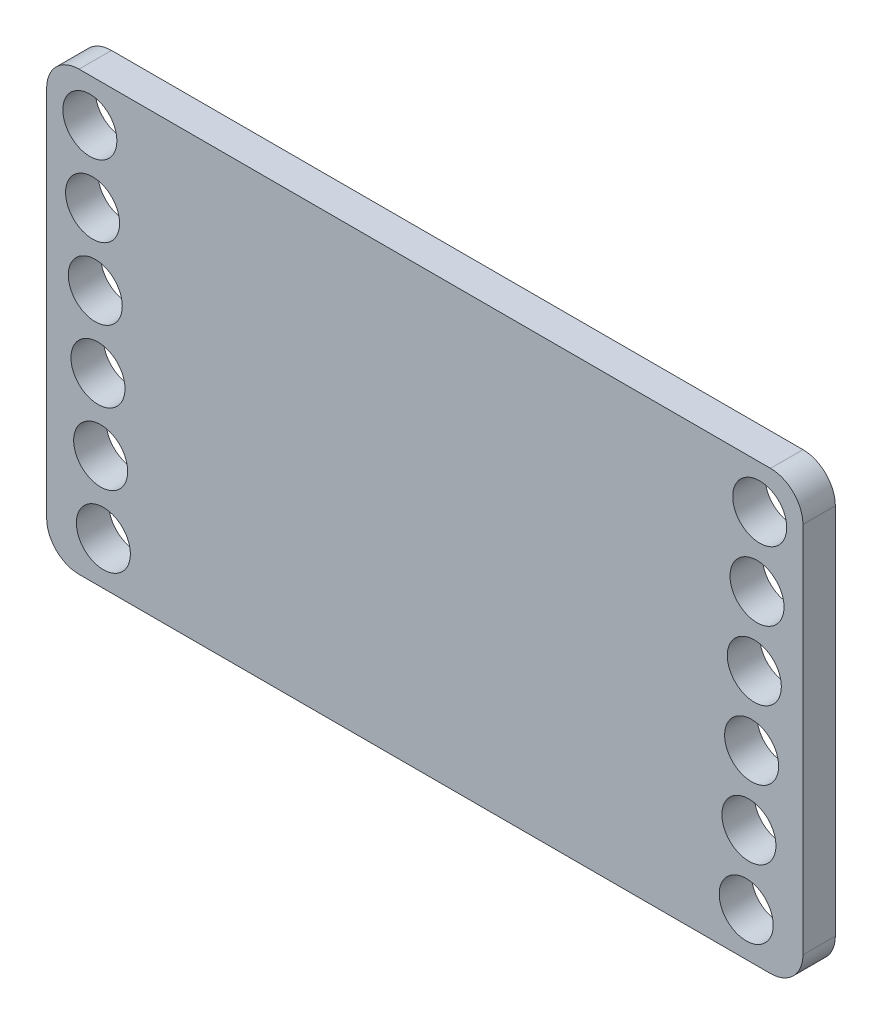
ISO-10303-21;
HEADER;
FILE_DESCRIPTION(('STEP AP214'),'2;1');
FILE_NAME('part.step','',(''),(''),'','','');
FILE_SCHEMA(('AUTOMOTIVE_DESIGN { 1 0 10303 214 1 1 1 1 }'));
ENDSEC;
DATA;
#1=APPLICATION_CONTEXT('core data for automotive mechanical design processes');
#2=APPLICATION_PROTOCOL_DEFINITION('international standard','automotive_design',2000,#1);
#3=PRODUCT_CONTEXT('',#1,'mechanical');
#4=PRODUCT('Part','Part','',(#3));
#5=PRODUCT_RELATED_PRODUCT_CATEGORY('part','',(#4));
#6=PRODUCT_DEFINITION_FORMATION('','',#4);
#7=PRODUCT_DEFINITION_CONTEXT('part definition',#1,'design');
#8=PRODUCT_DEFINITION('design','',#6,#7);
#9=PRODUCT_DEFINITION_SHAPE('','',#8);
#10=(LENGTH_UNIT() NAMED_UNIT(*) SI_UNIT(.MILLI.,.METRE.));
#11=(NAMED_UNIT(*) PLANE_ANGLE_UNIT() SI_UNIT($,.RADIAN.));
#12=(NAMED_UNIT(*) SI_UNIT($,.STERADIAN.) SOLID_ANGLE_UNIT());
#13=UNCERTAINTY_MEASURE_WITH_UNIT(LENGTH_MEASURE(1.E-05),#10,'distance_accuracy_value','');
#14=(GEOMETRIC_REPRESENTATION_CONTEXT(3) GLOBAL_UNCERTAINTY_ASSIGNED_CONTEXT((#13)) GLOBAL_UNIT_ASSIGNED_CONTEXT((#10,
#11,#12)) REPRESENTATION_CONTEXT('',''));
#15=CARTESIAN_POINT('',(0.,0.,0.));
#16=DIRECTION('',(0.,0.,1.));
#17=DIRECTION('',(1.,0.,0.));
#18=AXIS2_PLACEMENT_3D('',#15,#16,#17);
#19=CARTESIAN_POINT('',(-35.,0.,3.));
#20=DIRECTION('',(-1.,0.,0.));
#21=DIRECTION('',(0.,-1.,0.));
#22=AXIS2_PLACEMENT_3D('',#19,#20,#21);
#23=PLANE('',#22);
#24=DIRECTION('',(0.,1.,0.));
#25=VECTOR('',#24,1.);
#26=CARTESIAN_POINT('',(-35.,0.,3.));
#27=LINE('',#26,#25);
#28=CARTESIAN_POINT('',(-35.,2.50000000000001,3.));
#29=VERTEX_POINT('',#28);
#30=CARTESIAN_POINT('',(-35.,37.,3.));
#31=VERTEX_POINT('',#30);
#32=EDGE_CURVE('E203',#29,#31,#27,.T.);
#33=ORIENTED_EDGE('',*,*,#32,.T.);
#34=DIRECTION('',(0.,0.,-1.));
#35=VECTOR('',#34,1.);
#36=CARTESIAN_POINT('',(-35.,37.,3.));
#37=LINE('',#36,#35);
#38=CARTESIAN_POINT('',(-35.,37.,0.));
#39=VERTEX_POINT('',#38);
#40=EDGE_CURVE('E151',#31,#39,#37,.T.);
#41=ORIENTED_EDGE('',*,*,#40,.T.);
#42=DIRECTION('',(0.,1.,0.));
#43=VECTOR('',#42,1.);
#44=CARTESIAN_POINT('',(-35.,0.,0.));
#45=LINE('',#44,#43);
#46=CARTESIAN_POINT('',(-35.,2.50000000000001,0.));
#47=VERTEX_POINT('',#46);
#48=EDGE_CURVE('E105',#47,#39,#45,.T.);
#49=ORIENTED_EDGE('',*,*,#48,.F.);
#50=DIRECTION('',(0.,0.,-1.));
#51=VECTOR('',#50,1.);
#52=CARTESIAN_POINT('',(-35.,2.50000000000001,3.));
#53=LINE('',#52,#51);
#54=EDGE_CURVE('E149',#47,#29,#53,.F.);
#55=ORIENTED_EDGE('',*,*,#54,.T.);
#56=EDGE_LOOP('',(#33,#41,#49,#55));
#57=FACE_BOUND('',#56,.T.);
#58=ADVANCED_FACE('F35',(#57),#23,.T.);
#59=CARTESIAN_POINT('',(0.,-0.499999999999993,3.));
#60=DIRECTION('',(0.,1.,0.));
#61=DIRECTION('',(0.,0.,1.));
#62=AXIS2_PLACEMENT_3D('',#59,#60,#61);
#63=PLANE('',#62);
#64=DIRECTION('',(1.,0.,0.));
#65=VECTOR('',#64,1.);
#66=CARTESIAN_POINT('',(0.,-0.499999999999993,0.));
#67=LINE('',#66,#65);
#68=CARTESIAN_POINT('',(-32.,-0.499999999999993,0.));
#69=VERTEX_POINT('',#68);
#70=CARTESIAN_POINT('',(32.,-0.499999999999993,0.));
#71=VERTEX_POINT('',#70);
#72=EDGE_CURVE('E156',#69,#71,#67,.T.);
#73=ORIENTED_EDGE('',*,*,#72,.T.);
#74=DIRECTION('',(0.,0.,-1.));
#75=VECTOR('',#74,1.);
#76=CARTESIAN_POINT('',(32.,-0.499999999999993,3.));
#77=LINE('',#76,#75);
#78=CARTESIAN_POINT('',(32.,-0.499999999999993,3.));
#79=VERTEX_POINT('',#78);
#80=EDGE_CURVE('E11',#71,#79,#77,.F.);
#81=ORIENTED_EDGE('',*,*,#80,.T.);
#82=DIRECTION('',(1.,0.,0.));
#83=VECTOR('',#82,1.);
#84=CARTESIAN_POINT('',(0.,-0.499999999999993,3.));
#85=LINE('',#84,#83);
#86=CARTESIAN_POINT('',(-32.,-0.499999999999993,3.));
#87=VERTEX_POINT('',#86);
#88=EDGE_CURVE('E157',#87,#79,#85,.T.);
#89=ORIENTED_EDGE('',*,*,#88,.F.);
#90=DIRECTION('',(0.,0.,-1.));
#91=VECTOR('',#90,1.);
#92=CARTESIAN_POINT('',(-32.,-0.499999999999993,0.));
#93=LINE('',#92,#91);
#94=EDGE_CURVE('E43',#87,#69,#93,.T.);
#95=ORIENTED_EDGE('',*,*,#94,.T.);
#96=EDGE_LOOP('',(#73,#81,#89,#95));
#97=FACE_BOUND('',#96,.T.);
#98=ADVANCED_FACE('F155',(#97),#63,.F.);
#99=CARTESIAN_POINT('',(35.,0.,3.));
#100=DIRECTION('',(-1.,0.,0.));
#101=DIRECTION('',(0.,-1.,0.));
#102=AXIS2_PLACEMENT_3D('',#99,#100,#101);
#103=PLANE('',#102);
#104=DIRECTION('',(0.,1.,0.));
#105=VECTOR('',#104,1.);
#106=CARTESIAN_POINT('',(35.,0.,0.));
#107=LINE('',#106,#105);
#108=CARTESIAN_POINT('',(35.,2.50000000000001,0.));
#109=VERTEX_POINT('',#108);
#110=CARTESIAN_POINT('',(35.,37.,0.));
#111=VERTEX_POINT('',#110);
#112=EDGE_CURVE('E122',#109,#111,#107,.T.);
#113=ORIENTED_EDGE('',*,*,#112,.T.);
#114=DIRECTION('',(0.,0.,-1.));
#115=VECTOR('',#114,1.);
#116=CARTESIAN_POINT('',(35.,37.,3.));
#117=LINE('',#116,#115);
#118=CARTESIAN_POINT('',(35.,37.,3.));
#119=VERTEX_POINT('',#118);
#120=EDGE_CURVE('E141',#111,#119,#117,.F.);
#121=ORIENTED_EDGE('',*,*,#120,.T.);
#122=DIRECTION('',(0.,1.,0.));
#123=VECTOR('',#122,1.);
#124=CARTESIAN_POINT('',(35.,0.,3.));
#125=LINE('',#124,#123);
#126=CARTESIAN_POINT('',(35.,2.50000000000001,3.));
#127=VERTEX_POINT('',#126);
#128=EDGE_CURVE('E131',#127,#119,#125,.T.);
#129=ORIENTED_EDGE('',*,*,#128,.F.);
#130=DIRECTION('',(0.,0.,-1.));
#131=VECTOR('',#130,1.);
#132=CARTESIAN_POINT('',(35.,2.50000000000001,3.));
#133=LINE('',#132,#131);
#134=EDGE_CURVE('E138',#127,#109,#133,.T.);
#135=ORIENTED_EDGE('',*,*,#134,.T.);
#136=EDGE_LOOP('',(#113,#121,#129,#135));
#137=FACE_BOUND('',#136,.T.);
#138=ADVANCED_FACE('F278',(#137),#103,.F.);
#139=CARTESIAN_POINT('',(30.5,23.,3.));
#140=DIRECTION('',(0.,0.,-1.));
#141=DIRECTION('',(-1.,0.,0.));
#142=AXIS2_PLACEMENT_3D('',#139,#140,#141);
#143=CYLINDRICAL_SURFACE('',#142,2.5);
#144=CARTESIAN_POINT('',(30.5,23.,3.));
#145=DIRECTION('',(0.,0.,1.));
#146=DIRECTION('',(1.,0.,0.));
#147=AXIS2_PLACEMENT_3D('',#144,#145,#146);
#148=CIRCLE('',#147,2.5);
#149=CARTESIAN_POINT('',(33.,23.,3.));
#150=VERTEX_POINT('',#149);
#151=EDGE_CURVE('E206',#150,#150,#148,.T.);
#152=ORIENTED_EDGE('',*,*,#151,.T.);
#153=EDGE_LOOP('',(#152));
#154=FACE_BOUND('',#153,.T.);
#155=CARTESIAN_POINT('',(30.5,23.,0.));
#156=DIRECTION('',(0.,0.,1.));
#157=DIRECTION('',(1.,0.,0.));
#158=AXIS2_PLACEMENT_3D('',#155,#156,#157);
#159=CIRCLE('',#158,2.5);
#160=CARTESIAN_POINT('',(33.,23.,0.));
#161=VERTEX_POINT('',#160);
#162=EDGE_CURVE('E162',#161,#161,#159,.T.);
#163=ORIENTED_EDGE('',*,*,#162,.F.);
#164=EDGE_LOOP('',(#163));
#165=FACE_BOUND('',#164,.T.);
#166=ADVANCED_FACE('F296',(#154,#165),#143,.F.);
#167=CARTESIAN_POINT('',(-30.5,23.,3.));
#168=DIRECTION('',(0.,0.,-1.));
#169=DIRECTION('',(-1.,0.,0.));
#170=AXIS2_PLACEMENT_3D('',#167,#168,#169);
#171=CYLINDRICAL_SURFACE('',#170,2.5);
#172=CARTESIAN_POINT('',(-30.5,23.,3.));
#173=DIRECTION('',(0.,0.,1.));
#174=DIRECTION('',(1.,0.,0.));
#175=AXIS2_PLACEMENT_3D('',#172,#173,#174);
#176=CIRCLE('',#175,2.5);
#177=CARTESIAN_POINT('',(-28.,23.,3.));
#178=VERTEX_POINT('',#177);
#179=EDGE_CURVE('E209',#178,#178,#176,.T.);
#180=ORIENTED_EDGE('',*,*,#179,.T.);
#181=EDGE_LOOP('',(#180));
#182=FACE_BOUND('',#181,.T.);
#183=CARTESIAN_POINT('',(-30.5,23.,0.));
#184=DIRECTION('',(0.,0.,1.));
#185=DIRECTION('',(1.,0.,0.));
#186=AXIS2_PLACEMENT_3D('',#183,#184,#185);
#187=CIRCLE('',#186,2.5);
#188=CARTESIAN_POINT('',(-28.,23.,0.));
#189=VERTEX_POINT('',#188);
#190=EDGE_CURVE('E167',#189,#189,#187,.T.);
#191=ORIENTED_EDGE('',*,*,#190,.F.);
#192=EDGE_LOOP('',(#191));
#193=FACE_BOUND('',#192,.T.);
#194=ADVANCED_FACE('F299',(#182,#193),#171,.F.);
#195=CARTESIAN_POINT('',(-30.25,16.5,3.));
#196=DIRECTION('',(0.,0.,-1.));
#197=DIRECTION('',(-1.,0.,0.));
#198=AXIS2_PLACEMENT_3D('',#195,#196,#197);
#199=CYLINDRICAL_SURFACE('',#198,2.5);
#200=CARTESIAN_POINT('',(-30.25,16.5,3.));
#201=DIRECTION('',(0.,0.,1.));
#202=DIRECTION('',(1.,0.,0.));
#203=AXIS2_PLACEMENT_3D('',#200,#201,#202);
#204=CIRCLE('',#203,2.5);
#205=CARTESIAN_POINT('',(-27.75,16.5,3.));
#206=VERTEX_POINT('',#205);
#207=EDGE_CURVE('E212',#206,#206,#204,.T.);
#208=ORIENTED_EDGE('',*,*,#207,.T.);
#209=EDGE_LOOP('',(#208));
#210=FACE_BOUND('',#209,.T.);
#211=CARTESIAN_POINT('',(-30.25,16.5,0.));
#212=DIRECTION('',(0.,0.,1.));
#213=DIRECTION('',(1.,0.,0.));
#214=AXIS2_PLACEMENT_3D('',#211,#212,#213);
#215=CIRCLE('',#214,2.5);
#216=CARTESIAN_POINT('',(-27.75,16.5,0.));
#217=VERTEX_POINT('',#216);
#218=EDGE_CURVE('E170',#217,#217,#215,.T.);
#219=ORIENTED_EDGE('',*,*,#218,.F.);
#220=EDGE_LOOP('',(#219));
#221=FACE_BOUND('',#220,.T.);
#222=ADVANCED_FACE('F303',(#210,#221),#199,.F.);
#223=CARTESIAN_POINT('',(30.25,16.5,3.));
#224=DIRECTION('',(0.,0.,-1.));
#225=DIRECTION('',(-1.,0.,0.));
#226=AXIS2_PLACEMENT_3D('',#223,#224,#225);
#227=CYLINDRICAL_SURFACE('',#226,2.5);
#228=CARTESIAN_POINT('',(30.25,16.5,3.));
#229=DIRECTION('',(0.,0.,1.));
#230=DIRECTION('',(1.,0.,0.));
#231=AXIS2_PLACEMENT_3D('',#228,#229,#230);
#232=CIRCLE('',#231,2.5);
#233=CARTESIAN_POINT('',(32.75,16.5,3.));
#234=VERTEX_POINT('',#233);
#235=EDGE_CURVE('E215',#234,#234,#232,.T.);
#236=ORIENTED_EDGE('',*,*,#235,.T.);
#237=EDGE_LOOP('',(#236));
#238=FACE_BOUND('',#237,.T.);
#239=CARTESIAN_POINT('',(30.25,16.5,0.));
#240=DIRECTION('',(0.,0.,1.));
#241=DIRECTION('',(1.,0.,0.));
#242=AXIS2_PLACEMENT_3D('',#239,#240,#241);
#243=CIRCLE('',#242,2.5);
#244=CARTESIAN_POINT('',(32.75,16.5,0.));
#245=VERTEX_POINT('',#244);
#246=EDGE_CURVE('E173',#245,#245,#243,.T.);
#247=ORIENTED_EDGE('',*,*,#246,.F.);
#248=EDGE_LOOP('',(#247));
#249=FACE_BOUND('',#248,.T.);
#250=ADVANCED_FACE('F307',(#238,#249),#227,.F.);
#251=CARTESIAN_POINT('',(30.,10.,3.));
#252=DIRECTION('',(0.,0.,-1.));
#253=DIRECTION('',(-1.,0.,0.));
#254=AXIS2_PLACEMENT_3D('',#251,#252,#253);
#255=CYLINDRICAL_SURFACE('',#254,2.5);
#256=CARTESIAN_POINT('',(30.,10.,3.));
#257=DIRECTION('',(0.,0.,1.));
#258=DIRECTION('',(1.,0.,0.));
#259=AXIS2_PLACEMENT_3D('',#256,#257,#258);
#260=CIRCLE('',#259,2.5);
#261=CARTESIAN_POINT('',(32.5,10.,3.));
#262=VERTEX_POINT('',#261);
#263=EDGE_CURVE('E218',#262,#262,#260,.T.);
#264=ORIENTED_EDGE('',*,*,#263,.T.);
#265=EDGE_LOOP('',(#264));
#266=FACE_BOUND('',#265,.T.);
#267=CARTESIAN_POINT('',(30.,10.,0.));
#268=DIRECTION('',(0.,0.,1.));
#269=DIRECTION('',(1.,0.,0.));
#270=AXIS2_PLACEMENT_3D('',#267,#268,#269);
#271=CIRCLE('',#270,2.5);
#272=CARTESIAN_POINT('',(32.5,10.,0.));
#273=VERTEX_POINT('',#272);
#274=EDGE_CURVE('E176',#273,#273,#271,.T.);
#275=ORIENTED_EDGE('',*,*,#274,.F.);
#276=EDGE_LOOP('',(#275));
#277=FACE_BOUND('',#276,.T.);
#278=ADVANCED_FACE('F311',(#266,#277),#255,.F.);
#279=CARTESIAN_POINT('',(-30.,10.,3.));
#280=DIRECTION('',(0.,0.,-1.));
#281=DIRECTION('',(-1.,0.,0.));
#282=AXIS2_PLACEMENT_3D('',#279,#280,#281);
#283=CYLINDRICAL_SURFACE('',#282,2.5);
#284=CARTESIAN_POINT('',(-30.,10.,3.));
#285=DIRECTION('',(0.,0.,1.));
#286=DIRECTION('',(1.,0.,0.));
#287=AXIS2_PLACEMENT_3D('',#284,#285,#286);
#288=CIRCLE('',#287,2.5);
#289=CARTESIAN_POINT('',(-27.5,10.,3.));
#290=VERTEX_POINT('',#289);
#291=EDGE_CURVE('E221',#290,#290,#288,.T.);
#292=ORIENTED_EDGE('',*,*,#291,.T.);
#293=EDGE_LOOP('',(#292));
#294=FACE_BOUND('',#293,.T.);
#295=CARTESIAN_POINT('',(-30.,10.,0.));
#296=DIRECTION('',(0.,0.,1.));
#297=DIRECTION('',(1.,0.,0.));
#298=AXIS2_PLACEMENT_3D('',#295,#296,#297);
#299=CIRCLE('',#298,2.5);
#300=CARTESIAN_POINT('',(-27.5,10.,0.));
#301=VERTEX_POINT('',#300);
#302=EDGE_CURVE('E179',#301,#301,#299,.T.);
#303=ORIENTED_EDGE('',*,*,#302,.F.);
#304=EDGE_LOOP('',(#303));
#305=FACE_BOUND('',#304,.T.);
#306=ADVANCED_FACE('F315',(#294,#305),#283,.F.);
#307=CARTESIAN_POINT('',(-31.,36.,3.));
#308=DIRECTION('',(0.,0.,-1.));
#309=DIRECTION('',(-1.,0.,0.));
#310=AXIS2_PLACEMENT_3D('',#307,#308,#309);
#311=CYLINDRICAL_SURFACE('',#310,2.5);
#312=CARTESIAN_POINT('',(-31.,36.,3.));
#313=DIRECTION('',(0.,0.,1.));
#314=DIRECTION('',(1.,0.,0.));
#315=AXIS2_PLACEMENT_3D('',#312,#313,#314);
#316=CIRCLE('',#315,2.5);
#317=CARTESIAN_POINT('',(-28.5,36.,3.));
#318=VERTEX_POINT('',#317);
#319=EDGE_CURVE('E224',#318,#318,#316,.T.);
#320=ORIENTED_EDGE('',*,*,#319,.T.);
#321=EDGE_LOOP('',(#320));
#322=FACE_BOUND('',#321,.T.);
#323=CARTESIAN_POINT('',(-31.,36.,0.));
#324=DIRECTION('',(0.,0.,1.));
#325=DIRECTION('',(1.,0.,0.));
#326=AXIS2_PLACEMENT_3D('',#323,#324,#325);
#327=CIRCLE('',#326,2.5);
#328=CARTESIAN_POINT('',(-28.5,36.,0.));
#329=VERTEX_POINT('',#328);
#330=EDGE_CURVE('E182',#329,#329,#327,.T.);
#331=ORIENTED_EDGE('',*,*,#330,.F.);
#332=EDGE_LOOP('',(#331));
#333=FACE_BOUND('',#332,.T.);
#334=ADVANCED_FACE('F319',(#322,#333),#311,.F.);
#335=CARTESIAN_POINT('',(-30.75,29.5,3.));
#336=DIRECTION('',(0.,0.,-1.));
#337=DIRECTION('',(-1.,0.,0.));
#338=AXIS2_PLACEMENT_3D('',#335,#336,#337);
#339=CYLINDRICAL_SURFACE('',#338,2.5);
#340=CARTESIAN_POINT('',(-30.75,29.5,3.));
#341=DIRECTION('',(0.,0.,1.));
#342=DIRECTION('',(1.,0.,0.));
#343=AXIS2_PLACEMENT_3D('',#340,#341,#342);
#344=CIRCLE('',#343,2.5);
#345=CARTESIAN_POINT('',(-28.25,29.5,3.));
#346=VERTEX_POINT('',#345);
#347=EDGE_CURVE('E227',#346,#346,#344,.T.);
#348=ORIENTED_EDGE('',*,*,#347,.T.);
#349=EDGE_LOOP('',(#348));
#350=FACE_BOUND('',#349,.T.);
#351=CARTESIAN_POINT('',(-30.75,29.5,0.));
#352=DIRECTION('',(0.,0.,1.));
#353=DIRECTION('',(1.,0.,0.));
#354=AXIS2_PLACEMENT_3D('',#351,#352,#353);
#355=CIRCLE('',#354,2.5);
#356=CARTESIAN_POINT('',(-28.25,29.5,0.));
#357=VERTEX_POINT('',#356);
#358=EDGE_CURVE('E185',#357,#357,#355,.T.);
#359=ORIENTED_EDGE('',*,*,#358,.F.);
#360=EDGE_LOOP('',(#359));
#361=FACE_BOUND('',#360,.T.);
#362=ADVANCED_FACE('F323',(#350,#361),#339,.F.);
#363=CARTESIAN_POINT('',(30.75,29.5,3.));
#364=DIRECTION('',(0.,0.,-1.));
#365=DIRECTION('',(-1.,0.,0.));
#366=AXIS2_PLACEMENT_3D('',#363,#364,#365);
#367=CYLINDRICAL_SURFACE('',#366,2.5);
#368=CARTESIAN_POINT('',(30.75,29.5,3.));
#369=DIRECTION('',(0.,0.,1.));
#370=DIRECTION('',(1.,0.,0.));
#371=AXIS2_PLACEMENT_3D('',#368,#369,#370);
#372=CIRCLE('',#371,2.5);
#373=CARTESIAN_POINT('',(33.25,29.5,3.));
#374=VERTEX_POINT('',#373);
#375=EDGE_CURVE('E230',#374,#374,#372,.T.);
#376=ORIENTED_EDGE('',*,*,#375,.T.);
#377=EDGE_LOOP('',(#376));
#378=FACE_BOUND('',#377,.T.);
#379=CARTESIAN_POINT('',(30.75,29.5,0.));
#380=DIRECTION('',(0.,0.,1.));
#381=DIRECTION('',(1.,0.,0.));
#382=AXIS2_PLACEMENT_3D('',#379,#380,#381);
#383=CIRCLE('',#382,2.5);
#384=CARTESIAN_POINT('',(33.25,29.5,0.));
#385=VERTEX_POINT('',#384);
#386=EDGE_CURVE('E188',#385,#385,#383,.T.);
#387=ORIENTED_EDGE('',*,*,#386,.F.);
#388=EDGE_LOOP('',(#387));
#389=FACE_BOUND('',#388,.T.);
#390=ADVANCED_FACE('F327',(#378,#389),#367,.F.);
#391=CARTESIAN_POINT('',(31.,36.,3.));
#392=DIRECTION('',(0.,0.,-1.));
#393=DIRECTION('',(-1.,0.,0.));
#394=AXIS2_PLACEMENT_3D('',#391,#392,#393);
#395=CYLINDRICAL_SURFACE('',#394,2.5);
#396=CARTESIAN_POINT('',(31.,36.,3.));
#397=DIRECTION('',(0.,0.,1.));
#398=DIRECTION('',(1.,0.,0.));
#399=AXIS2_PLACEMENT_3D('',#396,#397,#398);
#400=CIRCLE('',#399,2.5);
#401=CARTESIAN_POINT('',(33.5,36.,3.));
#402=VERTEX_POINT('',#401);
#403=EDGE_CURVE('E233',#402,#402,#400,.T.);
#404=ORIENTED_EDGE('',*,*,#403,.T.);
#405=EDGE_LOOP('',(#404));
#406=FACE_BOUND('',#405,.T.);
#407=CARTESIAN_POINT('',(31.,36.,0.));
#408=DIRECTION('',(0.,0.,1.));
#409=DIRECTION('',(1.,0.,0.));
#410=AXIS2_PLACEMENT_3D('',#407,#408,#409);
#411=CIRCLE('',#410,2.5);
#412=CARTESIAN_POINT('',(33.5,36.,0.));
#413=VERTEX_POINT('',#412);
#414=EDGE_CURVE('E191',#413,#413,#411,.T.);
#415=ORIENTED_EDGE('',*,*,#414,.F.);
#416=EDGE_LOOP('',(#415));
#417=FACE_BOUND('',#416,.T.);
#418=ADVANCED_FACE('F331',(#406,#417),#395,.F.);
#419=CARTESIAN_POINT('',(-29.75,3.5,3.));
#420=DIRECTION('',(0.,0.,-1.));
#421=DIRECTION('',(-1.,0.,0.));
#422=AXIS2_PLACEMENT_3D('',#419,#420,#421);
#423=CYLINDRICAL_SURFACE('',#422,2.5);
#424=CARTESIAN_POINT('',(-29.75,3.5,3.));
#425=DIRECTION('',(0.,0.,1.));
#426=DIRECTION('',(1.,0.,0.));
#427=AXIS2_PLACEMENT_3D('',#424,#425,#426);
#428=CIRCLE('',#427,2.5);
#429=CARTESIAN_POINT('',(-27.25,3.5,3.));
#430=VERTEX_POINT('',#429);
#431=EDGE_CURVE('E236',#430,#430,#428,.T.);
#432=ORIENTED_EDGE('',*,*,#431,.T.);
#433=EDGE_LOOP('',(#432));
#434=FACE_BOUND('',#433,.T.);
#435=CARTESIAN_POINT('',(-29.75,3.5,0.));
#436=DIRECTION('',(0.,0.,1.));
#437=DIRECTION('',(1.,0.,0.));
#438=AXIS2_PLACEMENT_3D('',#435,#436,#437);
#439=CIRCLE('',#438,2.5);
#440=CARTESIAN_POINT('',(-27.25,3.5,0.));
#441=VERTEX_POINT('',#440);
#442=EDGE_CURVE('E194',#441,#441,#439,.T.);
#443=ORIENTED_EDGE('',*,*,#442,.F.);
#444=EDGE_LOOP('',(#443));
#445=FACE_BOUND('',#444,.T.);
#446=ADVANCED_FACE('F335',(#434,#445),#423,.F.);
#447=CARTESIAN_POINT('',(29.75,3.5,3.));
#448=DIRECTION('',(0.,0.,-1.));
#449=DIRECTION('',(-1.,0.,0.));
#450=AXIS2_PLACEMENT_3D('',#447,#448,#449);
#451=CYLINDRICAL_SURFACE('',#450,2.5);
#452=CARTESIAN_POINT('',(29.75,3.5,3.));
#453=DIRECTION('',(0.,0.,1.));
#454=DIRECTION('',(1.,0.,0.));
#455=AXIS2_PLACEMENT_3D('',#452,#453,#454);
#456=CIRCLE('',#455,2.5);
#457=CARTESIAN_POINT('',(32.25,3.5,3.));
#458=VERTEX_POINT('',#457);
#459=EDGE_CURVE('E121',#458,#458,#456,.T.);
#460=ORIENTED_EDGE('',*,*,#459,.T.);
#461=EDGE_LOOP('',(#460));
#462=FACE_BOUND('',#461,.T.);
#463=CARTESIAN_POINT('',(29.75,3.5,0.));
#464=DIRECTION('',(0.,0.,1.));
#465=DIRECTION('',(1.,0.,0.));
#466=AXIS2_PLACEMENT_3D('',#463,#464,#465);
#467=CIRCLE('',#466,2.5);
#468=CARTESIAN_POINT('',(32.25,3.5,0.));
#469=VERTEX_POINT('',#468);
#470=EDGE_CURVE('E197',#469,#469,#467,.T.);
#471=ORIENTED_EDGE('',*,*,#470,.F.);
#472=EDGE_LOOP('',(#471));
#473=FACE_BOUND('',#472,.T.);
#474=ADVANCED_FACE('F242',(#462,#473),#451,.F.);
#475=CARTESIAN_POINT('',(0.,40.,3.));
#476=DIRECTION('',(0.,1.,0.));
#477=DIRECTION('',(-1.,0.,0.));
#478=AXIS2_PLACEMENT_3D('',#475,#476,#477);
#479=PLANE('',#478);
#480=DIRECTION('',(1.,0.,0.));
#481=VECTOR('',#480,1.);
#482=CARTESIAN_POINT('',(0.,40.,3.));
#483=LINE('',#482,#481);
#484=CARTESIAN_POINT('',(-32.,40.,3.));
#485=VERTEX_POINT('',#484);
#486=CARTESIAN_POINT('',(32.,40.,3.));
#487=VERTEX_POINT('',#486);
#488=EDGE_CURVE('E127',#485,#487,#483,.T.);
#489=ORIENTED_EDGE('',*,*,#488,.T.);
#490=DIRECTION('',(0.,0.,-1.));
#491=VECTOR('',#490,1.);
#492=CARTESIAN_POINT('',(32.,40.,0.));
#493=LINE('',#492,#491);
#494=CARTESIAN_POINT('',(32.,40.,0.));
#495=VERTEX_POINT('',#494);
#496=EDGE_CURVE('E120',#487,#495,#493,.T.);
#497=ORIENTED_EDGE('',*,*,#496,.T.);
#498=DIRECTION('',(1.,0.,0.));
#499=VECTOR('',#498,1.);
#500=CARTESIAN_POINT('',(0.,40.,0.));
#501=LINE('',#500,#499);
#502=CARTESIAN_POINT('',(-32.,40.,0.));
#503=VERTEX_POINT('',#502);
#504=EDGE_CURVE('E103',#503,#495,#501,.T.);
#505=ORIENTED_EDGE('',*,*,#504,.F.);
#506=DIRECTION('',(0.,0.,-1.));
#507=VECTOR('',#506,1.);
#508=CARTESIAN_POINT('',(-32.,40.,3.));
#509=LINE('',#508,#507);
#510=EDGE_CURVE('E117',#503,#485,#509,.F.);
#511=ORIENTED_EDGE('',*,*,#510,.T.);
#512=EDGE_LOOP('',(#489,#497,#505,#511));
#513=FACE_BOUND('',#512,.T.);
#514=ADVANCED_FACE('F116',(#513),#479,.T.);
#515=CARTESIAN_POINT('',(0.,0.,3.));
#516=DIRECTION('',(0.,0.,1.));
#517=DIRECTION('',(1.,0.,0.));
#518=AXIS2_PLACEMENT_3D('',#515,#516,#517);
#519=PLANE('',#518);
#520=ORIENTED_EDGE('',*,*,#459,.F.);
#521=EDGE_LOOP('',(#520));
#522=FACE_BOUND('',#521,.T.);
#523=ORIENTED_EDGE('',*,*,#431,.F.);
#524=EDGE_LOOP('',(#523));
#525=FACE_BOUND('',#524,.T.);
#526=ORIENTED_EDGE('',*,*,#403,.F.);
#527=EDGE_LOOP('',(#526));
#528=FACE_BOUND('',#527,.T.);
#529=ORIENTED_EDGE('',*,*,#375,.F.);
#530=EDGE_LOOP('',(#529));
#531=FACE_BOUND('',#530,.T.);
#532=ORIENTED_EDGE('',*,*,#347,.F.);
#533=EDGE_LOOP('',(#532));
#534=FACE_BOUND('',#533,.T.);
#535=ORIENTED_EDGE('',*,*,#319,.F.);
#536=EDGE_LOOP('',(#535));
#537=FACE_BOUND('',#536,.T.);
#538=ORIENTED_EDGE('',*,*,#291,.F.);
#539=EDGE_LOOP('',(#538));
#540=FACE_BOUND('',#539,.T.);
#541=ORIENTED_EDGE('',*,*,#263,.F.);
#542=EDGE_LOOP('',(#541));
#543=FACE_BOUND('',#542,.T.);
#544=ORIENTED_EDGE('',*,*,#235,.F.);
#545=EDGE_LOOP('',(#544));
#546=FACE_BOUND('',#545,.T.);
#547=ORIENTED_EDGE('',*,*,#207,.F.);
#548=EDGE_LOOP('',(#547));
#549=FACE_BOUND('',#548,.T.);
#550=ORIENTED_EDGE('',*,*,#179,.F.);
#551=EDGE_LOOP('',(#550));
#552=FACE_BOUND('',#551,.T.);
#553=ORIENTED_EDGE('',*,*,#151,.F.);
#554=EDGE_LOOP('',(#553));
#555=FACE_BOUND('',#554,.T.);
#556=ORIENTED_EDGE('',*,*,#128,.T.);
#557=CARTESIAN_POINT('',(32.,37.,3.));
#558=DIRECTION('',(0.,0.,1.));
#559=DIRECTION('',(1.,0.,0.));
#560=AXIS2_PLACEMENT_3D('',#557,#558,#559);
#561=CIRCLE('',#560,3.);
#562=EDGE_CURVE('E147',#119,#487,#561,.T.);
#563=ORIENTED_EDGE('',*,*,#562,.T.);
#564=ORIENTED_EDGE('',*,*,#488,.F.);
#565=CARTESIAN_POINT('',(-32.,37.,3.));
#566=DIRECTION('',(0.,0.,1.));
#567=DIRECTION('',(1.,0.,0.));
#568=AXIS2_PLACEMENT_3D('',#565,#566,#567);
#569=CIRCLE('',#568,3.);
#570=EDGE_CURVE('E126',#485,#31,#569,.T.);
#571=ORIENTED_EDGE('',*,*,#570,.T.);
#572=ORIENTED_EDGE('',*,*,#32,.F.);
#573=CARTESIAN_POINT('',(-32.,2.50000000000001,3.));
#574=DIRECTION('',(0.,0.,1.));
#575=DIRECTION('',(1.,0.,0.));
#576=AXIS2_PLACEMENT_3D('',#573,#574,#575);
#577=CIRCLE('',#576,3.);
#578=EDGE_CURVE('E55',#29,#87,#577,.T.);
#579=ORIENTED_EDGE('',*,*,#578,.T.);
#580=ORIENTED_EDGE('',*,*,#88,.T.);
#581=CARTESIAN_POINT('',(32.,2.50000000000001,3.));
#582=DIRECTION('',(0.,0.,1.));
#583=DIRECTION('',(1.,0.,0.));
#584=AXIS2_PLACEMENT_3D('',#581,#582,#583);
#585=CIRCLE('',#584,3.);
#586=EDGE_CURVE('E144',#79,#127,#585,.T.);
#587=ORIENTED_EDGE('',*,*,#586,.T.);
#588=EDGE_LOOP('',(#556,#563,#564,#571,#572,#579,#580,#587));
#589=FACE_BOUND('',#588,.T.);
#590=ADVANCED_FACE('F245',(#522,#525,#528,#531,#534,#537,#540,#543,#546,#549,#552,#555,#589),
#519,.T.);
#591=CARTESIAN_POINT('',(0.,0.,0.));
#592=DIRECTION('',(0.,0.,1.));
#593=DIRECTION('',(1.,0.,0.));
#594=AXIS2_PLACEMENT_3D('',#591,#592,#593);
#595=PLANE('',#594);
#596=ORIENTED_EDGE('',*,*,#470,.T.);
#597=EDGE_LOOP('',(#596));
#598=FACE_BOUND('',#597,.T.);
#599=ORIENTED_EDGE('',*,*,#442,.T.);
#600=EDGE_LOOP('',(#599));
#601=FACE_BOUND('',#600,.T.);
#602=ORIENTED_EDGE('',*,*,#414,.T.);
#603=EDGE_LOOP('',(#602));
#604=FACE_BOUND('',#603,.T.);
#605=ORIENTED_EDGE('',*,*,#386,.T.);
#606=EDGE_LOOP('',(#605));
#607=FACE_BOUND('',#606,.T.);
#608=ORIENTED_EDGE('',*,*,#358,.T.);
#609=EDGE_LOOP('',(#608));
#610=FACE_BOUND('',#609,.T.);
#611=ORIENTED_EDGE('',*,*,#330,.T.);
#612=EDGE_LOOP('',(#611));
#613=FACE_BOUND('',#612,.T.);
#614=ORIENTED_EDGE('',*,*,#302,.T.);
#615=EDGE_LOOP('',(#614));
#616=FACE_BOUND('',#615,.T.);
#617=ORIENTED_EDGE('',*,*,#274,.T.);
#618=EDGE_LOOP('',(#617));
#619=FACE_BOUND('',#618,.T.);
#620=ORIENTED_EDGE('',*,*,#246,.T.);
#621=EDGE_LOOP('',(#620));
#622=FACE_BOUND('',#621,.T.);
#623=ORIENTED_EDGE('',*,*,#218,.T.);
#624=EDGE_LOOP('',(#623));
#625=FACE_BOUND('',#624,.T.);
#626=ORIENTED_EDGE('',*,*,#190,.T.);
#627=EDGE_LOOP('',(#626));
#628=FACE_BOUND('',#627,.T.);
#629=ORIENTED_EDGE('',*,*,#162,.T.);
#630=EDGE_LOOP('',(#629));
#631=FACE_BOUND('',#630,.T.);
#632=ORIENTED_EDGE('',*,*,#504,.T.);
#633=CARTESIAN_POINT('',(32.,37.,0.));
#634=DIRECTION('',(0.,0.,1.));
#635=DIRECTION('',(1.,0.,0.));
#636=AXIS2_PLACEMENT_3D('',#633,#634,#635);
#637=CIRCLE('',#636,3.);
#638=EDGE_CURVE('E110',#495,#111,#637,.F.);
#639=ORIENTED_EDGE('',*,*,#638,.T.);
#640=ORIENTED_EDGE('',*,*,#112,.F.);
#641=CARTESIAN_POINT('',(32.,2.50000000000001,0.));
#642=DIRECTION('',(0.,0.,1.));
#643=DIRECTION('',(1.,0.,0.));
#644=AXIS2_PLACEMENT_3D('',#641,#642,#643);
#645=CIRCLE('',#644,3.);
#646=EDGE_CURVE('E111',#109,#71,#645,.F.);
#647=ORIENTED_EDGE('',*,*,#646,.T.);
#648=ORIENTED_EDGE('',*,*,#72,.F.);
#649=CARTESIAN_POINT('',(-32.,2.50000000000001,0.));
#650=DIRECTION('',(0.,0.,1.));
#651=DIRECTION('',(1.,0.,0.));
#652=AXIS2_PLACEMENT_3D('',#649,#650,#651);
#653=CIRCLE('',#652,3.);
#654=EDGE_CURVE('E129',#69,#47,#653,.F.);
#655=ORIENTED_EDGE('',*,*,#654,.T.);
#656=ORIENTED_EDGE('',*,*,#48,.T.);
#657=CARTESIAN_POINT('',(-32.,37.,0.));
#658=DIRECTION('',(0.,0.,1.));
#659=DIRECTION('',(1.,0.,0.));
#660=AXIS2_PLACEMENT_3D('',#657,#658,#659);
#661=CIRCLE('',#660,3.);
#662=EDGE_CURVE('E100',#39,#503,#661,.F.);
#663=ORIENTED_EDGE('',*,*,#662,.T.);
#664=EDGE_LOOP('',(#632,#639,#640,#647,#648,#655,#656,#663));
#665=FACE_BOUND('',#664,.T.);
#666=ADVANCED_FACE('F102',(#598,#601,#604,#607,#610,#613,#616,#619,#622,#625,#628,#631,#665),
#595,.F.);
#667=CARTESIAN_POINT('',(32.,37.,3.));
#668=DIRECTION('',(0.,0.,1.));
#669=DIRECTION('',(1.,0.,0.));
#670=AXIS2_PLACEMENT_3D('',#667,#668,#669);
#671=CYLINDRICAL_SURFACE('',#670,3.);
#672=ORIENTED_EDGE('',*,*,#562,.F.);
#673=ORIENTED_EDGE('',*,*,#120,.F.);
#674=ORIENTED_EDGE('',*,*,#638,.F.);
#675=ORIENTED_EDGE('',*,*,#496,.F.);
#676=EDGE_LOOP('',(#672,#673,#674,#675));
#677=FACE_BOUND('',#676,.T.);
#678=ADVANCED_FACE('F277',(#677),#671,.T.);
#679=CARTESIAN_POINT('',(-32.,37.,3.));
#680=DIRECTION('',(0.,0.,-1.));
#681=DIRECTION('',(-1.,0.,0.));
#682=AXIS2_PLACEMENT_3D('',#679,#680,#681);
#683=CYLINDRICAL_SURFACE('',#682,3.);
#684=ORIENTED_EDGE('',*,*,#570,.F.);
#685=ORIENTED_EDGE('',*,*,#510,.F.);
#686=ORIENTED_EDGE('',*,*,#662,.F.);
#687=ORIENTED_EDGE('',*,*,#40,.F.);
#688=EDGE_LOOP('',(#684,#685,#686,#687));
#689=FACE_BOUND('',#688,.T.);
#690=ADVANCED_FACE('F125',(#689),#683,.T.);
#691=CARTESIAN_POINT('',(32.,2.50000000000001,3.));
#692=DIRECTION('',(0.,0.,-1.));
#693=DIRECTION('',(-1.,0.,0.));
#694=AXIS2_PLACEMENT_3D('',#691,#692,#693);
#695=CYLINDRICAL_SURFACE('',#694,3.);
#696=ORIENTED_EDGE('',*,*,#586,.F.);
#697=ORIENTED_EDGE('',*,*,#80,.F.);
#698=ORIENTED_EDGE('',*,*,#646,.F.);
#699=ORIENTED_EDGE('',*,*,#134,.F.);
#700=EDGE_LOOP('',(#696,#697,#698,#699));
#701=FACE_BOUND('',#700,.T.);
#702=ADVANCED_FACE('F280',(#701),#695,.T.);
#703=CARTESIAN_POINT('',(-32.,2.50000000000001,3.));
#704=DIRECTION('',(0.,0.,1.));
#705=DIRECTION('',(1.,0.,0.));
#706=AXIS2_PLACEMENT_3D('',#703,#704,#705);
#707=CYLINDRICAL_SURFACE('',#706,3.);
#708=ORIENTED_EDGE('',*,*,#578,.F.);
#709=ORIENTED_EDGE('',*,*,#54,.F.);
#710=ORIENTED_EDGE('',*,*,#654,.F.);
#711=ORIENTED_EDGE('',*,*,#94,.F.);
#712=EDGE_LOOP('',(#708,#709,#710,#711));
#713=FACE_BOUND('',#712,.T.);
#714=ADVANCED_FACE('F37',(#713),#707,.T.);
#715=CLOSED_SHELL('',(#58,#98,#138,#166,#194,#222,#250,#278,#306,#334,#362,#390,#418,#446,#474,
#514,#590,#666,#678,#690,#702,#714));
#716=MANIFOLD_SOLID_BREP('B2',#715);
#717=ADVANCED_BREP_SHAPE_REPRESENTATION('',(#18,#716),#14);
#718=SHAPE_DEFINITION_REPRESENTATION(#9,#717);
ENDSEC;
END-ISO-10303-21;
